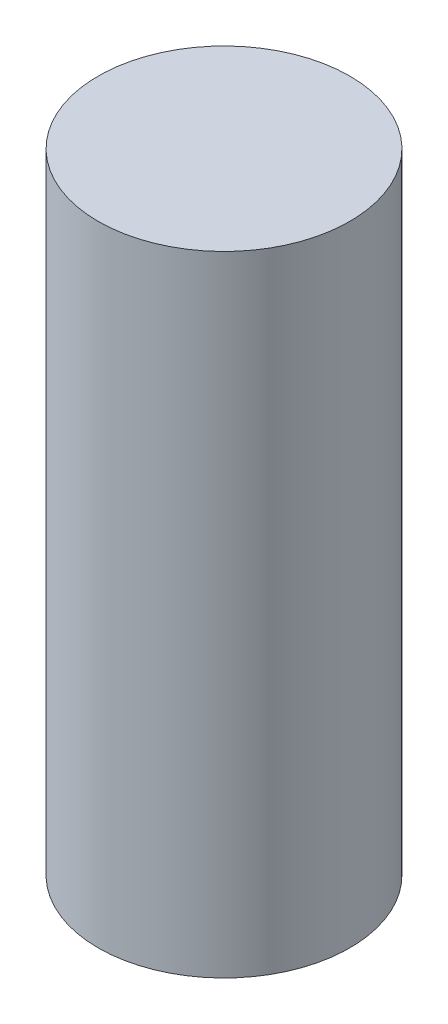
ISO-10303-21;
HEADER;
FILE_DESCRIPTION(('STEP AP214'),'2;1');
FILE_NAME('part.step','',(''),(''),'','','');
FILE_SCHEMA(('AUTOMOTIVE_DESIGN { 1 0 10303 214 1 1 1 1 }'));
ENDSEC;
DATA;
#1=APPLICATION_CONTEXT('core data for automotive mechanical design processes');
#2=APPLICATION_PROTOCOL_DEFINITION('international standard','automotive_design',2000,#1);
#3=PRODUCT_CONTEXT('',#1,'mechanical');
#4=PRODUCT('Part','Part','',(#3));
#5=PRODUCT_RELATED_PRODUCT_CATEGORY('part','',(#4));
#6=PRODUCT_DEFINITION_FORMATION('','',#4);
#7=PRODUCT_DEFINITION_CONTEXT('part definition',#1,'design');
#8=PRODUCT_DEFINITION('design','',#6,#7);
#9=PRODUCT_DEFINITION_SHAPE('','',#8);
#10=(LENGTH_UNIT() NAMED_UNIT(*) SI_UNIT(.MILLI.,.METRE.));
#11=(NAMED_UNIT(*) PLANE_ANGLE_UNIT() SI_UNIT($,.RADIAN.));
#12=(NAMED_UNIT(*) SI_UNIT($,.STERADIAN.) SOLID_ANGLE_UNIT());
#13=UNCERTAINTY_MEASURE_WITH_UNIT(LENGTH_MEASURE(1.E-05),#10,'distance_accuracy_value','');
#14=(GEOMETRIC_REPRESENTATION_CONTEXT(3) GLOBAL_UNCERTAINTY_ASSIGNED_CONTEXT((#13)) GLOBAL_UNIT_ASSIGNED_CONTEXT((#10,
#11,#12)) REPRESENTATION_CONTEXT('',''));
#15=CARTESIAN_POINT('',(0.,0.,0.));
#16=DIRECTION('',(0.,0.,1.));
#17=DIRECTION('',(1.,0.,0.));
#18=AXIS2_PLACEMENT_3D('',#15,#16,#17);
#19=CARTESIAN_POINT('',(0.,-40.,0.));
#20=DIRECTION('',(0.,1.,0.));
#21=DIRECTION('',(0.,0.,1.));
#22=AXIS2_PLACEMENT_3D('',#19,#20,#21);
#23=CYLINDRICAL_SURFACE('',#22,8.);
#24=CARTESIAN_POINT('',(0.,-40.,0.));
#25=DIRECTION('',(0.,1.,0.));
#26=DIRECTION('',(0.,0.,1.));
#27=AXIS2_PLACEMENT_3D('',#24,#25,#26);
#28=CIRCLE('',#27,8.);
#29=CARTESIAN_POINT('',(0.,-40.,8.));
#30=VERTEX_POINT('',#29);
#31=EDGE_CURVE('E10',#30,#30,#28,.T.);
#32=ORIENTED_EDGE('',*,*,#31,.T.);
#33=EDGE_LOOP('',(#32));
#34=FACE_BOUND('',#33,.T.);
#35=CARTESIAN_POINT('',(0.,0.,0.));
#36=DIRECTION('',(0.,1.,0.));
#37=DIRECTION('',(0.,0.,1.));
#38=AXIS2_PLACEMENT_3D('',#35,#36,#37);
#39=CIRCLE('',#38,8.);
#40=CARTESIAN_POINT('',(0.,0.,8.));
#41=VERTEX_POINT('',#40);
#42=EDGE_CURVE('E44',#41,#41,#39,.T.);
#43=ORIENTED_EDGE('',*,*,#42,.F.);
#44=EDGE_LOOP('',(#43));
#45=FACE_BOUND('',#44,.T.);
#46=ADVANCED_FACE('F41',(#34,#45),#23,.T.);
#47=CARTESIAN_POINT('',(0.,-40.,0.));
#48=DIRECTION('',(0.,1.,0.));
#49=DIRECTION('',(0.,0.,1.));
#50=AXIS2_PLACEMENT_3D('',#47,#48,#49);
#51=PLANE('',#50);
#52=ORIENTED_EDGE('',*,*,#31,.F.);
#53=EDGE_LOOP('',(#52));
#54=FACE_BOUND('',#53,.T.);
#55=ADVANCED_FACE('F58',(#54),#51,.F.);
#56=CARTESIAN_POINT('',(0.,0.,0.));
#57=DIRECTION('',(0.,1.,0.));
#58=DIRECTION('',(0.,0.,1.));
#59=AXIS2_PLACEMENT_3D('',#56,#57,#58);
#60=PLANE('',#59);
#61=ORIENTED_EDGE('',*,*,#42,.T.);
#62=EDGE_LOOP('',(#61));
#63=FACE_BOUND('',#62,.T.);
#64=ADVANCED_FACE('F55',(#63),#60,.T.);
#65=CLOSED_SHELL('',(#46,#55,#64));
#66=MANIFOLD_SOLID_BREP('B2',#65);
#67=ADVANCED_BREP_SHAPE_REPRESENTATION('',(#18,#66),#14);
#68=SHAPE_DEFINITION_REPRESENTATION(#9,#67);
ENDSEC;
END-ISO-10303-21;
